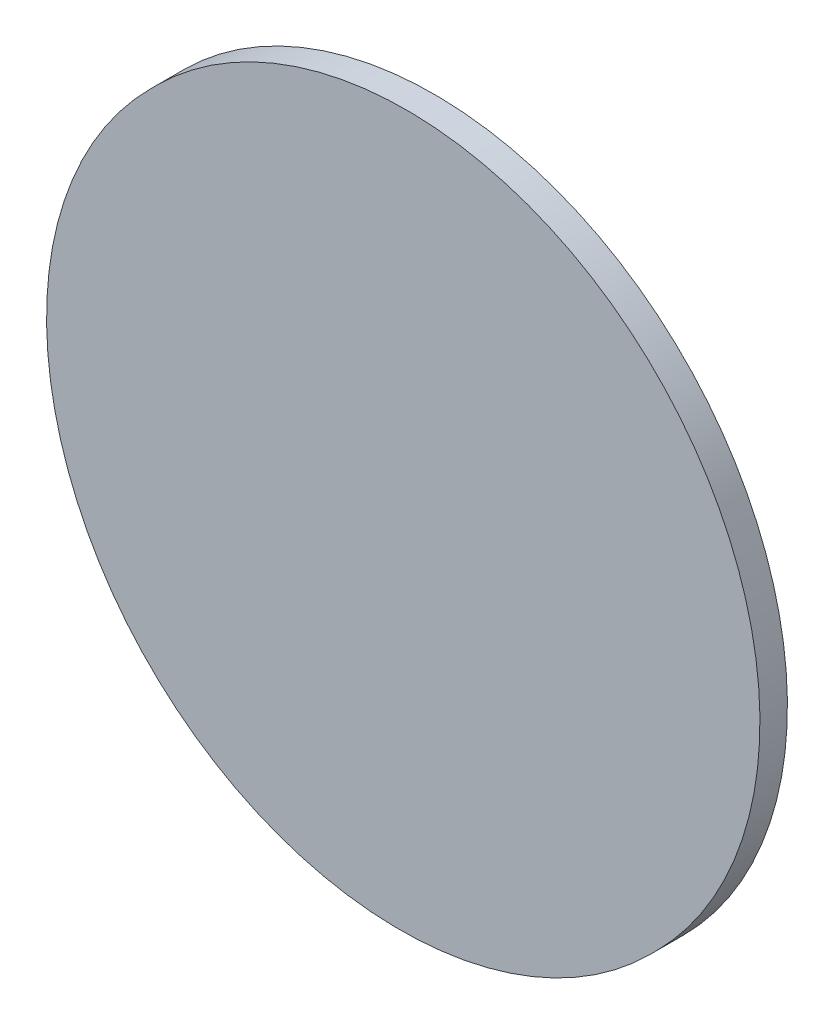
ISO-10303-21;
HEADER;
FILE_DESCRIPTION(('STEP AP214'),'2;1');
FILE_NAME('part.step','',(''),(''),'','','');
FILE_SCHEMA(('AUTOMOTIVE_DESIGN { 1 0 10303 214 1 1 1 1 }'));
ENDSEC;
DATA;
#1=APPLICATION_CONTEXT('core data for automotive mechanical design processes');
#2=APPLICATION_PROTOCOL_DEFINITION('international standard','automotive_design',2000,#1);
#3=PRODUCT_CONTEXT('',#1,'mechanical');
#4=PRODUCT('Part','Part','',(#3));
#5=PRODUCT_RELATED_PRODUCT_CATEGORY('part','',(#4));
#6=PRODUCT_DEFINITION_FORMATION('','',#4);
#7=PRODUCT_DEFINITION_CONTEXT('part definition',#1,'design');
#8=PRODUCT_DEFINITION('design','',#6,#7);
#9=PRODUCT_DEFINITION_SHAPE('','',#8);
#10=(LENGTH_UNIT() NAMED_UNIT(*) SI_UNIT(.MILLI.,.METRE.));
#11=(NAMED_UNIT(*) PLANE_ANGLE_UNIT() SI_UNIT($,.RADIAN.));
#12=(NAMED_UNIT(*) SI_UNIT($,.STERADIAN.) SOLID_ANGLE_UNIT());
#13=UNCERTAINTY_MEASURE_WITH_UNIT(LENGTH_MEASURE(1.E-05),#10,'distance_accuracy_value','');
#14=(GEOMETRIC_REPRESENTATION_CONTEXT(3) GLOBAL_UNCERTAINTY_ASSIGNED_CONTEXT((#13)) GLOBAL_UNIT_ASSIGNED_CONTEXT((#10,
#11,#12)) REPRESENTATION_CONTEXT('',''));
#15=CARTESIAN_POINT('',(0.,0.,0.));
#16=DIRECTION('',(0.,0.,1.));
#17=DIRECTION('',(1.,0.,0.));
#18=AXIS2_PLACEMENT_3D('',#15,#16,#17);
#19=CARTESIAN_POINT('',(169.339698,-116.858198,1.635));
#20=DIRECTION('',(0.,0.,1.));
#21=DIRECTION('',(1.,0.,0.));
#22=AXIS2_PLACEMENT_3D('',#19,#20,#21);
#23=PLANE('',#22);
#24=DIRECTION('',(0.707106781186548,0.707106781186548,0.));
#25=VECTOR('',#24,1.);
#26=CARTESIAN_POINT('',(169.339698,-116.858198,1.635));
#27=LINE('',#26,#25);
#28=CARTESIAN_POINT('',(169.339698,-116.858198,1.635));
#29=VERTEX_POINT('',#28);
#30=CARTESIAN_POINT('',(169.348198,-116.849698,1.635));
#31=VERTEX_POINT('',#30);
#32=EDGE_CURVE('E84',#29,#31,#27,.T.);
#33=ORIENTED_EDGE('',*,*,#32,.T.);
#34=CARTESIAN_POINT('',(169.0299995,-116.5314995,1.635));
#35=DIRECTION('',(0.,0.,1.));
#36=DIRECTION('',(0.707106781186548,-0.707106781186548,0.));
#37=AXIS2_PLACEMENT_3D('',#34,#35,#36);
#38=CIRCLE('',#37,0.450000634227);
#39=CARTESIAN_POINT('',(168.711801,-116.213301,1.635));
#40=VERTEX_POINT('',#39);
#41=EDGE_CURVE('E70',#31,#40,#38,.T.);
#42=ORIENTED_EDGE('',*,*,#41,.T.);
#43=DIRECTION('',(-0.707106781186548,-0.707106781186548,0.));
#44=VECTOR('',#43,1.);
#45=CARTESIAN_POINT('',(168.711801,-116.213301,1.635));
#46=LINE('',#45,#44);
#47=CARTESIAN_POINT('',(168.703301,-116.221801,1.635));
#48=VERTEX_POINT('',#47);
#49=EDGE_CURVE('E103',#40,#48,#46,.T.);
#50=ORIENTED_EDGE('',*,*,#49,.T.);
#51=CARTESIAN_POINT('',(169.0214995,-116.5399995,1.635));
#52=DIRECTION('',(0.,0.,1.));
#53=DIRECTION('',(-0.707106781186548,0.707106781186548,0.));
#54=AXIS2_PLACEMENT_3D('',#51,#52,#53);
#55=CIRCLE('',#54,0.450000634227);
#56=EDGE_CURVE('E11',#48,#29,#55,.T.);
#57=ORIENTED_EDGE('',*,*,#56,.T.);
#58=EDGE_LOOP('',(#33,#42,#50,#57));
#59=FACE_BOUND('',#58,.T.);
#60=ADVANCED_FACE('F17',(#59),#23,.T.);
#61=CARTESIAN_POINT('',(169.339698,-116.858198,1.6));
#62=DIRECTION('',(0.,0.,1.));
#63=DIRECTION('',(1.,0.,0.));
#64=AXIS2_PLACEMENT_3D('',#61,#62,#63);
#65=PLANE('',#64);
#66=CARTESIAN_POINT('',(169.0214995,-116.5399995,1.6));
#67=DIRECTION('',(0.,0.,1.));
#68=DIRECTION('',(-0.707106781186548,0.707106781186548,0.));
#69=AXIS2_PLACEMENT_3D('',#66,#67,#68);
#70=CIRCLE('',#69,0.450000634227);
#71=CARTESIAN_POINT('',(168.703301,-116.221801,1.6));
#72=VERTEX_POINT('',#71);
#73=CARTESIAN_POINT('',(169.339698,-116.858198,1.6));
#74=VERTEX_POINT('',#73);
#75=EDGE_CURVE('E25',#72,#74,#70,.T.);
#76=ORIENTED_EDGE('',*,*,#75,.F.);
#77=DIRECTION('',(-0.707106781186548,-0.707106781186548,0.));
#78=VECTOR('',#77,1.);
#79=CARTESIAN_POINT('',(168.711801,-116.213301,1.6));
#80=LINE('',#79,#78);
#81=CARTESIAN_POINT('',(168.711801,-116.213301,1.6));
#82=VERTEX_POINT('',#81);
#83=EDGE_CURVE('E81',#82,#72,#80,.T.);
#84=ORIENTED_EDGE('',*,*,#83,.F.);
#85=CARTESIAN_POINT('',(169.0299995,-116.5314995,1.6));
#86=DIRECTION('',(0.,0.,1.));
#87=DIRECTION('',(0.707106781186548,-0.707106781186548,0.));
#88=AXIS2_PLACEMENT_3D('',#85,#86,#87);
#89=CIRCLE('',#88,0.450000634227);
#90=CARTESIAN_POINT('',(169.348198,-116.849698,1.6));
#91=VERTEX_POINT('',#90);
#92=EDGE_CURVE('E101',#91,#82,#89,.T.);
#93=ORIENTED_EDGE('',*,*,#92,.F.);
#94=DIRECTION('',(0.707106781186548,0.707106781186548,0.));
#95=VECTOR('',#94,1.);
#96=CARTESIAN_POINT('',(169.339698,-116.858198,1.6));
#97=LINE('',#96,#95);
#98=EDGE_CURVE('E91',#74,#91,#97,.T.);
#99=ORIENTED_EDGE('',*,*,#98,.F.);
#100=EDGE_LOOP('',(#76,#84,#93,#99));
#101=FACE_BOUND('',#100,.T.);
#102=ADVANCED_FACE('F121',(#101),#65,.F.);
#103=CARTESIAN_POINT('',(169.0214995,-116.5399995,1.6));
#104=DIRECTION('',(0.,0.,-1.));
#105=DIRECTION('',(-0.707106781186548,0.707106781186548,0.));
#106=AXIS2_PLACEMENT_3D('',#103,#104,#105);
#107=CYLINDRICAL_SURFACE('',#106,0.450000634227);
#108=ORIENTED_EDGE('',*,*,#75,.T.);
#109=DIRECTION('',(0.,0.,1.));
#110=VECTOR('',#109,1.);
#111=CARTESIAN_POINT('',(169.339698,-116.858198,1.6));
#112=LINE('',#111,#110);
#113=EDGE_CURVE('E88',#74,#29,#112,.T.);
#114=ORIENTED_EDGE('',*,*,#113,.T.);
#115=ORIENTED_EDGE('',*,*,#56,.F.);
#116=DIRECTION('',(0.,0.,1.));
#117=VECTOR('',#116,1.);
#118=CARTESIAN_POINT('',(168.703301,-116.221801,1.6));
#119=LINE('',#118,#117);
#120=EDGE_CURVE('E105',#72,#48,#119,.T.);
#121=ORIENTED_EDGE('',*,*,#120,.F.);
#122=EDGE_LOOP('',(#108,#114,#115,#121));
#123=FACE_BOUND('',#122,.T.);
#124=ADVANCED_FACE('F119',(#123),#107,.T.);
#125=CARTESIAN_POINT('',(168.711801,-116.213301,1.6));
#126=DIRECTION('',(0.707106781186548,-0.707106781186548,0.));
#127=DIRECTION('',(0.,0.,-1.));
#128=AXIS2_PLACEMENT_3D('',#125,#126,#127);
#129=PLANE('',#128);
#130=ORIENTED_EDGE('',*,*,#83,.T.);
#131=ORIENTED_EDGE('',*,*,#120,.T.);
#132=ORIENTED_EDGE('',*,*,#49,.F.);
#133=DIRECTION('',(0.,0.,1.));
#134=VECTOR('',#133,1.);
#135=CARTESIAN_POINT('',(168.711801,-116.213301,1.6));
#136=LINE('',#135,#134);
#137=EDGE_CURVE('E78',#82,#40,#136,.T.);
#138=ORIENTED_EDGE('',*,*,#137,.F.);
#139=EDGE_LOOP('',(#130,#131,#132,#138));
#140=FACE_BOUND('',#139,.T.);
#141=ADVANCED_FACE('F118',(#140),#129,.F.);
#142=CARTESIAN_POINT('',(169.0299995,-116.5314995,1.6));
#143=DIRECTION('',(0.,0.,-1.));
#144=DIRECTION('',(0.707106781186548,-0.707106781186548,0.));
#145=AXIS2_PLACEMENT_3D('',#142,#143,#144);
#146=CYLINDRICAL_SURFACE('',#145,0.450000634227);
#147=ORIENTED_EDGE('',*,*,#92,.T.);
#148=ORIENTED_EDGE('',*,*,#137,.T.);
#149=ORIENTED_EDGE('',*,*,#41,.F.);
#150=DIRECTION('',(0.,0.,1.));
#151=VECTOR('',#150,1.);
#152=CARTESIAN_POINT('',(169.348198,-116.849698,1.6));
#153=LINE('',#152,#151);
#154=EDGE_CURVE('E75',#91,#31,#153,.T.);
#155=ORIENTED_EDGE('',*,*,#154,.F.);
#156=EDGE_LOOP('',(#147,#148,#149,#155));
#157=FACE_BOUND('',#156,.T.);
#158=ADVANCED_FACE('F73',(#157),#146,.T.);
#159=CARTESIAN_POINT('',(169.339698,-116.858198,1.6));
#160=DIRECTION('',(-0.707106781186548,0.707106781186548,0.));
#161=DIRECTION('',(0.,0.,1.));
#162=AXIS2_PLACEMENT_3D('',#159,#160,#161);
#163=PLANE('',#162);
#164=ORIENTED_EDGE('',*,*,#98,.T.);
#165=ORIENTED_EDGE('',*,*,#154,.T.);
#166=ORIENTED_EDGE('',*,*,#32,.F.);
#167=ORIENTED_EDGE('',*,*,#113,.F.);
#168=EDGE_LOOP('',(#164,#165,#166,#167));
#169=FACE_BOUND('',#168,.T.);
#170=ADVANCED_FACE('F90',(#169),#163,.F.);
#171=CLOSED_SHELL('',(#60,#102,#124,#141,#158,#170));
#172=MANIFOLD_SOLID_BREP('B1',#171);
#173=ADVANCED_BREP_SHAPE_REPRESENTATION('',(#18,#172),#14);
#174=SHAPE_DEFINITION_REPRESENTATION(#9,#173);
ENDSEC;
END-ISO-10303-21;
